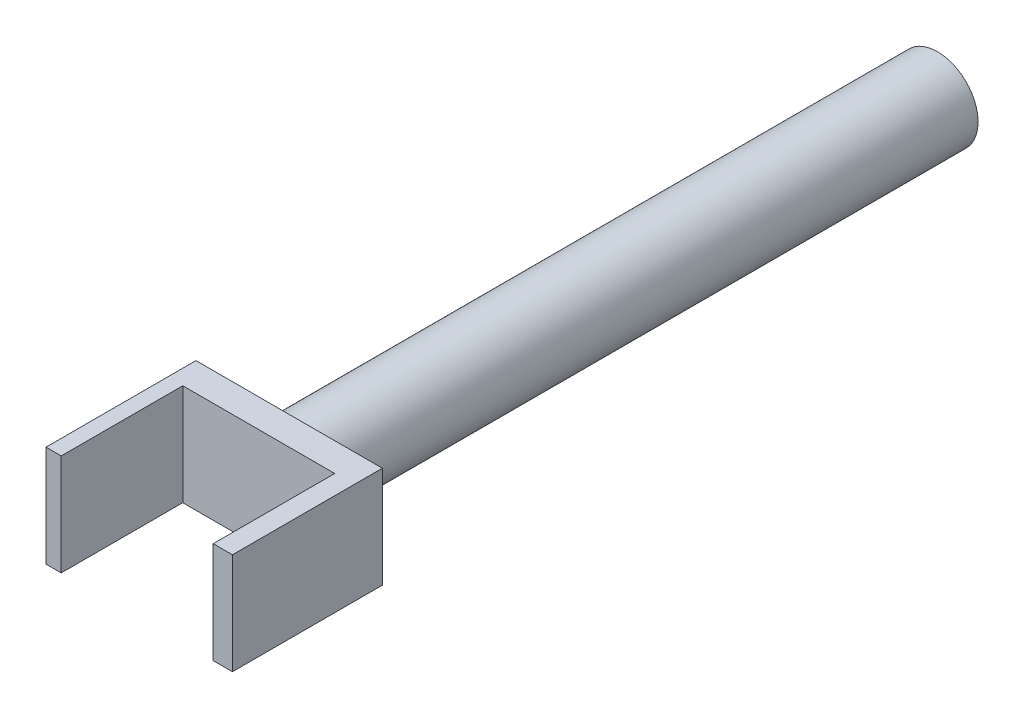
ISO-10303-21;
HEADER;
FILE_DESCRIPTION(('STEP AP214'),'2;1');
FILE_NAME('part.step','',(''),(''),'','','');
FILE_SCHEMA(('AUTOMOTIVE_DESIGN { 1 0 10303 214 1 1 1 1 }'));
ENDSEC;
DATA;
#1=APPLICATION_CONTEXT('core data for automotive mechanical design processes');
#2=APPLICATION_PROTOCOL_DEFINITION('international standard','automotive_design',2000,#1);
#3=PRODUCT_CONTEXT('',#1,'mechanical');
#4=PRODUCT('Part','Part','',(#3));
#5=PRODUCT_RELATED_PRODUCT_CATEGORY('part','',(#4));
#6=PRODUCT_DEFINITION_FORMATION('','',#4);
#7=PRODUCT_DEFINITION_CONTEXT('part definition',#1,'design');
#8=PRODUCT_DEFINITION('design','',#6,#7);
#9=PRODUCT_DEFINITION_SHAPE('','',#8);
#10=(LENGTH_UNIT() NAMED_UNIT(*) SI_UNIT(.MILLI.,.METRE.));
#11=(NAMED_UNIT(*) PLANE_ANGLE_UNIT() SI_UNIT($,.RADIAN.));
#12=(NAMED_UNIT(*) SI_UNIT($,.STERADIAN.) SOLID_ANGLE_UNIT());
#13=UNCERTAINTY_MEASURE_WITH_UNIT(LENGTH_MEASURE(1.E-05),#10,'distance_accuracy_value','');
#14=(GEOMETRIC_REPRESENTATION_CONTEXT(3) GLOBAL_UNCERTAINTY_ASSIGNED_CONTEXT((#13)) GLOBAL_UNIT_ASSIGNED_CONTEXT((#10,
#11,#12)) REPRESENTATION_CONTEXT('',''));
#15=CARTESIAN_POINT('',(0.,0.,0.));
#16=DIRECTION('',(0.,0.,1.));
#17=DIRECTION('',(1.,0.,0.));
#18=AXIS2_PLACEMENT_3D('',#15,#16,#17);
#19=CARTESIAN_POINT('',(0.,0.,0.));
#20=DIRECTION('',(0.,0.,1.));
#21=DIRECTION('',(1.,0.,0.));
#22=AXIS2_PLACEMENT_3D('',#19,#20,#21);
#23=PLANE('',#22);
#24=DIRECTION('',(0.,1.,0.));
#25=VECTOR('',#24,1.);
#26=CARTESIAN_POINT('',(18.25,-18.4,0.));
#27=LINE('',#26,#25);
#28=CARTESIAN_POINT('',(18.25,-12.5,0.));
#29=VERTEX_POINT('',#28);
#30=CARTESIAN_POINT('',(18.25,12.5,0.));
#31=VERTEX_POINT('',#30);
#32=EDGE_CURVE('E172',#29,#31,#27,.T.);
#33=ORIENTED_EDGE('',*,*,#32,.F.);
#34=DIRECTION('',(1.,0.,0.));
#35=VECTOR('',#34,1.);
#36=CARTESIAN_POINT('',(-23.,-12.5,0.));
#37=LINE('',#36,#35);
#38=CARTESIAN_POINT('',(23.,-12.5,0.));
#39=VERTEX_POINT('',#38);
#40=EDGE_CURVE('E122',#29,#39,#37,.T.);
#41=ORIENTED_EDGE('',*,*,#40,.T.);
#42=DIRECTION('',(0.,1.,0.));
#43=VECTOR('',#42,1.);
#44=CARTESIAN_POINT('',(23.,12.5,0.));
#45=LINE('',#44,#43);
#46=CARTESIAN_POINT('',(23.,12.5,0.));
#47=VERTEX_POINT('',#46);
#48=EDGE_CURVE('E110',#39,#47,#45,.T.);
#49=ORIENTED_EDGE('',*,*,#48,.T.);
#50=DIRECTION('',(-1.,0.,0.));
#51=VECTOR('',#50,1.);
#52=CARTESIAN_POINT('',(-23.,12.5,0.));
#53=LINE('',#52,#51);
#54=EDGE_CURVE('E120',#47,#31,#53,.T.);
#55=ORIENTED_EDGE('',*,*,#54,.T.);
#56=EDGE_LOOP('',(#33,#41,#49,#55));
#57=FACE_BOUND('',#56,.T.);
#58=ADVANCED_FACE('F51',(#57),#23,.T.);
#59=CARTESIAN_POINT('',(23.,-12.5,-37.));
#60=DIRECTION('',(0.,0.,-1.));
#61=DIRECTION('',(1.,0.,0.));
#62=AXIS2_PLACEMENT_3D('',#59,#60,#61);
#63=PLANE('',#62);
#64=CARTESIAN_POINT('',(0.,0.,-37.));
#65=DIRECTION('',(0.,0.,-1.));
#66=DIRECTION('',(-1.,0.,0.));
#67=AXIS2_PLACEMENT_3D('',#64,#65,#66);
#68=CIRCLE('',#67,10.);
#69=CARTESIAN_POINT('',(-10.,0.,-37.));
#70=VERTEX_POINT('',#69);
#71=EDGE_CURVE('E151',#70,#70,#68,.T.);
#72=ORIENTED_EDGE('',*,*,#71,.F.);
#73=EDGE_LOOP('',(#72));
#74=FACE_BOUND('',#73,.T.);
#75=DIRECTION('',(0.,-1.,0.));
#76=VECTOR('',#75,1.);
#77=CARTESIAN_POINT('',(-23.,12.5,-37.));
#78=LINE('',#77,#76);
#79=CARTESIAN_POINT('',(-23.,12.5,-37.));
#80=VERTEX_POINT('',#79);
#81=CARTESIAN_POINT('',(-23.,-12.5,-37.));
#82=VERTEX_POINT('',#81);
#83=EDGE_CURVE('E142',#80,#82,#78,.T.);
#84=ORIENTED_EDGE('',*,*,#83,.F.);
#85=DIRECTION('',(-1.,0.,0.));
#86=VECTOR('',#85,1.);
#87=CARTESIAN_POINT('',(-23.,12.5,-37.));
#88=LINE('',#87,#86);
#89=CARTESIAN_POINT('',(23.,12.5,-37.));
#90=VERTEX_POINT('',#89);
#91=EDGE_CURVE('E114',#90,#80,#88,.T.);
#92=ORIENTED_EDGE('',*,*,#91,.F.);
#93=DIRECTION('',(0.,1.,0.));
#94=VECTOR('',#93,1.);
#95=CARTESIAN_POINT('',(23.,12.5,-37.));
#96=LINE('',#95,#94);
#97=CARTESIAN_POINT('',(23.,-12.5,-37.));
#98=VERTEX_POINT('',#97);
#99=EDGE_CURVE('E99',#98,#90,#96,.T.);
#100=ORIENTED_EDGE('',*,*,#99,.F.);
#101=DIRECTION('',(1.,0.,0.));
#102=VECTOR('',#101,1.);
#103=CARTESIAN_POINT('',(-23.,-12.5,-37.));
#104=LINE('',#103,#102);
#105=EDGE_CURVE('E95',#82,#98,#104,.T.);
#106=ORIENTED_EDGE('',*,*,#105,.F.);
#107=EDGE_LOOP('',(#84,#92,#100,#106));
#108=FACE_BOUND('',#107,.T.);
#109=ADVANCED_FACE('F53',(#74,#108),#63,.T.);
#110=DIRECTION('',(0.,-1.,0.));
#111=VECTOR('',#110,1.);
#112=CARTESIAN_POINT('',(-19.25,18.4,0.));
#113=LINE('',#112,#111);
#114=CARTESIAN_POINT('',(-19.25,12.5,0.));
#115=VERTEX_POINT('',#114);
#116=CARTESIAN_POINT('',(-19.25,-12.5,0.));
#117=VERTEX_POINT('',#116);
#118=EDGE_CURVE('E163',#115,#117,#113,.T.);
#119=ORIENTED_EDGE('',*,*,#118,.F.);
#120=CARTESIAN_POINT('',(-23.,12.5,0.));
#121=VERTEX_POINT('',#120);
#122=EDGE_CURVE('E124',#115,#121,#53,.T.);
#123=ORIENTED_EDGE('',*,*,#122,.T.);
#124=DIRECTION('',(0.,-1.,0.));
#125=VECTOR('',#124,1.);
#126=CARTESIAN_POINT('',(-23.,12.5,0.));
#127=LINE('',#126,#125);
#128=CARTESIAN_POINT('',(-23.,-12.5,0.));
#129=VERTEX_POINT('',#128);
#130=EDGE_CURVE('E139',#121,#129,#127,.T.);
#131=ORIENTED_EDGE('',*,*,#130,.T.);
#132=EDGE_CURVE('E125',#129,#117,#37,.T.);
#133=ORIENTED_EDGE('',*,*,#132,.T.);
#134=EDGE_LOOP('',(#119,#123,#131,#133));
#135=FACE_BOUND('',#134,.T.);
#136=ADVANCED_FACE('F171',(#135),#23,.T.);
#137=CARTESIAN_POINT('',(-23.,-12.5,-89.3545604508337));
#138=DIRECTION('',(0.,-1.,0.));
#139=DIRECTION('',(0.,0.,-1.));
#140=AXIS2_PLACEMENT_3D('',#137,#138,#139);
#141=PLANE('',#140);
#142=DIRECTION('',(0.,0.,1.));
#143=VECTOR('',#142,1.);
#144=CARTESIAN_POINT('',(18.25,-12.5,-89.3545604508337));
#145=LINE('',#144,#143);
#146=CARTESIAN_POINT('',(18.25,-12.5,-30.));
#147=VERTEX_POINT('',#146);
#148=EDGE_CURVE('E211',#147,#29,#145,.T.);
#149=ORIENTED_EDGE('',*,*,#148,.F.);
#150=DIRECTION('',(-1.,0.,0.));
#151=VECTOR('',#150,1.);
#152=CARTESIAN_POINT('',(-23.,-12.5,-30.));
#153=LINE('',#152,#151);
#154=CARTESIAN_POINT('',(-19.25,-12.5,-30.));
#155=VERTEX_POINT('',#154);
#156=EDGE_CURVE('E212',#147,#155,#153,.T.);
#157=ORIENTED_EDGE('',*,*,#156,.T.);
#158=DIRECTION('',(0.,0.,-1.));
#159=VECTOR('',#158,1.);
#160=CARTESIAN_POINT('',(-19.25,-12.5,-89.3545604508337));
#161=LINE('',#160,#159);
#162=EDGE_CURVE('E217',#117,#155,#161,.T.);
#163=ORIENTED_EDGE('',*,*,#162,.F.);
#164=ORIENTED_EDGE('',*,*,#132,.F.);
#165=DIRECTION('',(0.,0.,1.));
#166=VECTOR('',#165,1.);
#167=CARTESIAN_POINT('',(-23.,-12.5,-89.3545604508337));
#168=LINE('',#167,#166);
#169=EDGE_CURVE('E74',#82,#129,#168,.T.);
#170=ORIENTED_EDGE('',*,*,#169,.F.);
#171=ORIENTED_EDGE('',*,*,#105,.T.);
#172=DIRECTION('',(0.,0.,1.));
#173=VECTOR('',#172,1.);
#174=CARTESIAN_POINT('',(23.,-12.5,-89.3545604508337));
#175=LINE('',#174,#173);
#176=EDGE_CURVE('E131',#98,#39,#175,.T.);
#177=ORIENTED_EDGE('',*,*,#176,.T.);
#178=ORIENTED_EDGE('',*,*,#40,.F.);
#179=EDGE_LOOP('',(#149,#157,#163,#164,#170,#171,#177,#178));
#180=FACE_BOUND('',#179,.T.);
#181=ADVANCED_FACE('F197',(#180),#141,.T.);
#182=CARTESIAN_POINT('',(23.,12.5,-89.3545604508337));
#183=DIRECTION('',(1.,0.,0.));
#184=DIRECTION('',(0.,1.,0.));
#185=AXIS2_PLACEMENT_3D('',#182,#183,#184);
#186=PLANE('',#185);
#187=ORIENTED_EDGE('',*,*,#176,.F.);
#188=ORIENTED_EDGE('',*,*,#99,.T.);
#189=DIRECTION('',(0.,0.,1.));
#190=VECTOR('',#189,1.);
#191=CARTESIAN_POINT('',(23.,12.5,-89.3545604508337));
#192=LINE('',#191,#190);
#193=EDGE_CURVE('E107',#90,#47,#192,.T.);
#194=ORIENTED_EDGE('',*,*,#193,.T.);
#195=ORIENTED_EDGE('',*,*,#48,.F.);
#196=EDGE_LOOP('',(#187,#188,#194,#195));
#197=FACE_BOUND('',#196,.T.);
#198=ADVANCED_FACE('F109',(#197),#186,.T.);
#199=CARTESIAN_POINT('',(-23.,12.5,-89.3545604508337));
#200=DIRECTION('',(0.,1.,0.));
#201=DIRECTION('',(-1.,0.,0.));
#202=AXIS2_PLACEMENT_3D('',#199,#200,#201);
#203=PLANE('',#202);
#204=DIRECTION('',(0.,0.,-1.));
#205=VECTOR('',#204,1.);
#206=CARTESIAN_POINT('',(18.25,12.5,-89.3545604508337));
#207=LINE('',#206,#205);
#208=CARTESIAN_POINT('',(18.25,12.5,-30.));
#209=VERTEX_POINT('',#208);
#210=EDGE_CURVE('E11',#31,#209,#207,.T.);
#211=ORIENTED_EDGE('',*,*,#210,.F.);
#212=ORIENTED_EDGE('',*,*,#54,.F.);
#213=ORIENTED_EDGE('',*,*,#193,.F.);
#214=ORIENTED_EDGE('',*,*,#91,.T.);
#215=DIRECTION('',(0.,0.,1.));
#216=VECTOR('',#215,1.);
#217=CARTESIAN_POINT('',(-23.,12.5,-89.3545604508337));
#218=LINE('',#217,#216);
#219=EDGE_CURVE('E144',#80,#121,#218,.T.);
#220=ORIENTED_EDGE('',*,*,#219,.T.);
#221=ORIENTED_EDGE('',*,*,#122,.F.);
#222=DIRECTION('',(0.,0.,1.));
#223=VECTOR('',#222,1.);
#224=CARTESIAN_POINT('',(-19.25,12.5,-89.3545604508337));
#225=LINE('',#224,#223);
#226=CARTESIAN_POINT('',(-19.25,12.5,-30.));
#227=VERTEX_POINT('',#226);
#228=EDGE_CURVE('E59',#227,#115,#225,.T.);
#229=ORIENTED_EDGE('',*,*,#228,.F.);
#230=DIRECTION('',(1.,0.,0.));
#231=VECTOR('',#230,1.);
#232=CARTESIAN_POINT('',(-23.,12.5,-30.));
#233=LINE('',#232,#231);
#234=EDGE_CURVE('E152',#227,#209,#233,.T.);
#235=ORIENTED_EDGE('',*,*,#234,.T.);
#236=EDGE_LOOP('',(#211,#212,#213,#214,#220,#221,#229,#235));
#237=FACE_BOUND('',#236,.T.);
#238=ADVANCED_FACE('F128',(#237),#203,.T.);
#239=CARTESIAN_POINT('',(-23.,12.5,-89.3545604508337));
#240=DIRECTION('',(-1.,0.,0.));
#241=DIRECTION('',(0.,-1.,0.));
#242=AXIS2_PLACEMENT_3D('',#239,#240,#241);
#243=PLANE('',#242);
#244=ORIENTED_EDGE('',*,*,#219,.F.);
#245=ORIENTED_EDGE('',*,*,#83,.T.);
#246=ORIENTED_EDGE('',*,*,#169,.T.);
#247=ORIENTED_EDGE('',*,*,#130,.F.);
#248=EDGE_LOOP('',(#244,#245,#246,#247));
#249=FACE_BOUND('',#248,.T.);
#250=ADVANCED_FACE('F175',(#249),#243,.T.);
#251=CARTESIAN_POINT('',(0.,0.,-225.284271247462));
#252=DIRECTION('',(0.,0.,1.));
#253=DIRECTION('',(1.,0.,0.));
#254=AXIS2_PLACEMENT_3D('',#251,#252,#253);
#255=CYLINDRICAL_SURFACE('',#254,10.);
#256=ORIENTED_EDGE('',*,*,#71,.T.);
#257=EDGE_LOOP('',(#256));
#258=FACE_BOUND('',#257,.T.);
#259=CARTESIAN_POINT('',(0.,0.,-197.));
#260=DIRECTION('',(0.,0.,-1.));
#261=DIRECTION('',(-1.,0.,0.));
#262=AXIS2_PLACEMENT_3D('',#259,#260,#261);
#263=CIRCLE('',#262,10.);
#264=CARTESIAN_POINT('',(-10.,0.,-197.));
#265=VERTEX_POINT('',#264);
#266=EDGE_CURVE('E134',#265,#265,#263,.T.);
#267=ORIENTED_EDGE('',*,*,#266,.F.);
#268=EDGE_LOOP('',(#267));
#269=FACE_BOUND('',#268,.T.);
#270=ADVANCED_FACE('F177',(#258,#269),#255,.T.);
#271=CARTESIAN_POINT('',(0.,18.,-197.));
#272=DIRECTION('',(0.,0.,-1.));
#273=DIRECTION('',(1.,0.,0.));
#274=AXIS2_PLACEMENT_3D('',#271,#272,#273);
#275=PLANE('',#274);
#276=ORIENTED_EDGE('',*,*,#266,.T.);
#277=EDGE_LOOP('',(#276));
#278=FACE_BOUND('',#277,.T.);
#279=ADVANCED_FACE('F183',(#278),#275,.T.);
#280=CARTESIAN_POINT('',(18.25,-18.4,-30.));
#281=DIRECTION('',(1.,0.,0.));
#282=DIRECTION('',(0.,0.,-1.));
#283=AXIS2_PLACEMENT_3D('',#280,#281,#282);
#284=PLANE('',#283);
#285=ORIENTED_EDGE('',*,*,#148,.T.);
#286=ORIENTED_EDGE('',*,*,#32,.T.);
#287=ORIENTED_EDGE('',*,*,#210,.T.);
#288=DIRECTION('',(0.,1.,0.));
#289=VECTOR('',#288,1.);
#290=CARTESIAN_POINT('',(18.25,-18.4,-30.));
#291=LINE('',#290,#289);
#292=EDGE_CURVE('E66',#147,#209,#291,.T.);
#293=ORIENTED_EDGE('',*,*,#292,.F.);
#294=EDGE_LOOP('',(#285,#286,#287,#293));
#295=FACE_BOUND('',#294,.T.);
#296=ADVANCED_FACE('F230',(#295),#284,.F.);
#297=CARTESIAN_POINT('',(-19.25,18.4,-30.));
#298=DIRECTION('',(-1.,0.,0.));
#299=DIRECTION('',(0.,0.,1.));
#300=AXIS2_PLACEMENT_3D('',#297,#298,#299);
#301=PLANE('',#300);
#302=ORIENTED_EDGE('',*,*,#162,.T.);
#303=DIRECTION('',(0.,-1.,0.));
#304=VECTOR('',#303,1.);
#305=CARTESIAN_POINT('',(-19.25,18.4,-30.));
#306=LINE('',#305,#304);
#307=EDGE_CURVE('E167',#227,#155,#306,.T.);
#308=ORIENTED_EDGE('',*,*,#307,.F.);
#309=ORIENTED_EDGE('',*,*,#228,.T.);
#310=ORIENTED_EDGE('',*,*,#118,.T.);
#311=EDGE_LOOP('',(#302,#308,#309,#310));
#312=FACE_BOUND('',#311,.T.);
#313=ADVANCED_FACE('F161',(#312),#301,.F.);
#314=CARTESIAN_POINT('',(0.,0.,-30.));
#315=DIRECTION('',(0.,0.,1.));
#316=DIRECTION('',(1.,0.,0.));
#317=AXIS2_PLACEMENT_3D('',#314,#315,#316);
#318=PLANE('',#317);
#319=ORIENTED_EDGE('',*,*,#292,.T.);
#320=ORIENTED_EDGE('',*,*,#234,.F.);
#321=ORIENTED_EDGE('',*,*,#307,.T.);
#322=ORIENTED_EDGE('',*,*,#156,.F.);
#323=EDGE_LOOP('',(#319,#320,#321,#322));
#324=FACE_BOUND('',#323,.T.);
#325=ADVANCED_FACE('F226',(#324),#318,.T.);
#326=CLOSED_SHELL('',(#58,#109,#136,#181,#198,#238,#250,#270,#279,#296,#313,#325));
#327=MANIFOLD_SOLID_BREP('B2',#326);
#328=ADVANCED_BREP_SHAPE_REPRESENTATION('',(#18,#327),#14);
#329=SHAPE_DEFINITION_REPRESENTATION(#9,#328);
ENDSEC;
END-ISO-10303-21;
